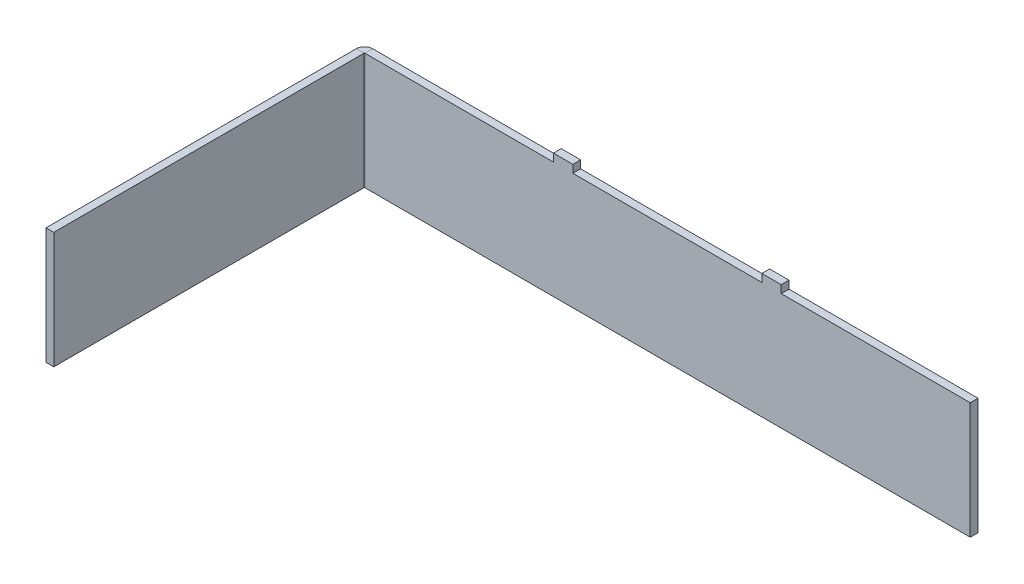
ISO-10303-21;
HEADER;
FILE_DESCRIPTION(('STEP AP214'),'2;1');
FILE_NAME('part.step','',(''),(''),'','','');
FILE_SCHEMA(('AUTOMOTIVE_DESIGN { 1 0 10303 214 1 1 1 1 }'));
ENDSEC;
DATA;
#1=APPLICATION_CONTEXT('core data for automotive mechanical design processes');
#2=APPLICATION_PROTOCOL_DEFINITION('international standard','automotive_design',2000,#1);
#3=PRODUCT_CONTEXT('',#1,'mechanical');
#4=PRODUCT('Part','Part','',(#3));
#5=PRODUCT_RELATED_PRODUCT_CATEGORY('part','',(#4));
#6=PRODUCT_DEFINITION_FORMATION('','',#4);
#7=PRODUCT_DEFINITION_CONTEXT('part definition',#1,'design');
#8=PRODUCT_DEFINITION('design','',#6,#7);
#9=PRODUCT_DEFINITION_SHAPE('','',#8);
#10=(LENGTH_UNIT() NAMED_UNIT(*) SI_UNIT(.MILLI.,.METRE.));
#11=(NAMED_UNIT(*) PLANE_ANGLE_UNIT() SI_UNIT($,.RADIAN.));
#12=(NAMED_UNIT(*) SI_UNIT($,.STERADIAN.) SOLID_ANGLE_UNIT());
#13=UNCERTAINTY_MEASURE_WITH_UNIT(LENGTH_MEASURE(1.E-05),#10,'distance_accuracy_value','');
#14=(GEOMETRIC_REPRESENTATION_CONTEXT(3) GLOBAL_UNCERTAINTY_ASSIGNED_CONTEXT((#13)) GLOBAL_UNIT_ASSIGNED_CONTEXT((#10,
#11,#12)) REPRESENTATION_CONTEXT('',''));
#15=CARTESIAN_POINT('',(0.,0.,0.));
#16=DIRECTION('',(0.,0.,1.));
#17=DIRECTION('',(1.,0.,0.));
#18=AXIS2_PLACEMENT_3D('',#15,#16,#17);
#19=CARTESIAN_POINT('',(718.692823516397,2.00000000000117,-26.0000000000004));
#20=DIRECTION('',(0.,0.,1.));
#21=DIRECTION('',(1.,0.,0.));
#22=AXIS2_PLACEMENT_3D('',#19,#20,#21);
#23=PLANE('',#22);
#24=DIRECTION('',(-1.,0.,0.));
#25=VECTOR('',#24,1.);
#26=CARTESIAN_POINT('',(718.692823516397,1.16874081210637E-12,-26.0000000000004));
#27=LINE('',#26,#25);
#28=CARTESIAN_POINT('',(550.,0.,-26.0000000000004));
#29=VERTEX_POINT('',#28);
#30=CARTESIAN_POINT('',(548.,0.,-26.0000000000004));
#31=VERTEX_POINT('',#30);
#32=EDGE_CURVE('E197',#29,#31,#27,.T.);
#33=ORIENTED_EDGE('',*,*,#32,.T.);
#34=DIRECTION('',(0.,1.,0.));
#35=VECTOR('',#34,1.);
#36=CARTESIAN_POINT('',(548.,2.00000000000006,-26.0000000000004));
#37=LINE('',#36,#35);
#38=CARTESIAN_POINT('',(548.,-29.9999999999999,-26.0000000000004));
#39=VERTEX_POINT('',#38);
#40=EDGE_CURVE('E180',#39,#31,#37,.T.);
#41=ORIENTED_EDGE('',*,*,#40,.F.);
#42=DIRECTION('',(-1.,0.,0.));
#43=VECTOR('',#42,1.);
#44=CARTESIAN_POINT('',(718.692823516398,-29.9999999999988,-26.0000000000003));
#45=LINE('',#44,#43);
#46=CARTESIAN_POINT('',(550.,-29.9999999999999,-26.0000000000003));
#47=VERTEX_POINT('',#46);
#48=EDGE_CURVE('E188',#47,#39,#45,.T.);
#49=ORIENTED_EDGE('',*,*,#48,.F.);
#50=DIRECTION('',(0.,1.,0.));
#51=VECTOR('',#50,1.);
#52=CARTESIAN_POINT('',(550.,2.00000000000008,-26.0000000000004));
#53=LINE('',#52,#51);
#54=EDGE_CURVE('E181',#47,#29,#53,.T.);
#55=ORIENTED_EDGE('',*,*,#54,.T.);
#56=EDGE_LOOP('',(#33,#41,#49,#55));
#57=FACE_BOUND('',#56,.T.);
#58=ADVANCED_FACE('F45',(#57),#23,.T.);
#59=CARTESIAN_POINT('',(718.692823516397,1.74790715661915E-12,600.));
#60=DIRECTION('',(0.,-1.,0.));
#61=DIRECTION('',(-1.,0.,0.));
#62=AXIS2_PLACEMENT_3D('',#59,#60,#61);
#63=PLANE('',#62);
#64=DIRECTION('',(0.,0.,-1.));
#65=VECTOR('',#64,1.);
#66=CARTESIAN_POINT('',(548.,0.,-108.));
#67=LINE('',#66,#65);
#68=CARTESIAN_POINT('',(548.,0.,-105.9));
#69=VERTEX_POINT('',#68);
#70=EDGE_CURVE('E175',#31,#69,#67,.T.);
#71=ORIENTED_EDGE('',*,*,#70,.F.);
#72=ORIENTED_EDGE('',*,*,#32,.F.);
#73=DIRECTION('',(0.,0.,1.));
#74=VECTOR('',#73,1.);
#75=CARTESIAN_POINT('',(550.,6.55401658870381E-13,600.));
#76=LINE('',#75,#74);
#77=CARTESIAN_POINT('',(550.,0.,-105.9));
#78=VERTEX_POINT('',#77);
#79=EDGE_CURVE('E12',#78,#29,#76,.T.);
#80=ORIENTED_EDGE('',*,*,#79,.F.);
#81=DIRECTION('',(-1.,0.,0.));
#82=VECTOR('',#81,1.);
#83=CARTESIAN_POINT('',(718.692823516397,1.09481846238341E-12,-105.9));
#84=LINE('',#83,#82);
#85=EDGE_CURVE('E172',#78,#69,#84,.T.);
#86=ORIENTED_EDGE('',*,*,#85,.T.);
#87=EDGE_LOOP('',(#71,#72,#80,#86));
#88=FACE_BOUND('',#87,.T.);
#89=ADVANCED_FACE('F174',(#88),#63,.F.);
#90=CARTESIAN_POINT('',(548.,-29.9999999999999,-28.0000000000004));
#91=DIRECTION('',(-1.,0.,0.));
#92=DIRECTION('',(0.,0.,1.));
#93=AXIS2_PLACEMENT_3D('',#90,#91,#92);
#94=PLANE('',#93);
#95=DIRECTION('',(0.,1.,0.));
#96=VECTOR('',#95,1.);
#97=CARTESIAN_POINT('',(548.,0.,-105.9));
#98=LINE('',#97,#96);
#99=CARTESIAN_POINT('',(548.,-30.,-105.9));
#100=VERTEX_POINT('',#99);
#101=EDGE_CURVE('E186',#100,#69,#98,.T.);
#102=ORIENTED_EDGE('',*,*,#101,.F.);
#103=DIRECTION('',(0.,0.,-1.));
#104=VECTOR('',#103,1.);
#105=CARTESIAN_POINT('',(548.,-29.9999999999999,-28.0000000000003));
#106=LINE('',#105,#104);
#107=EDGE_CURVE('E284',#39,#100,#106,.T.);
#108=ORIENTED_EDGE('',*,*,#107,.F.);
#109=ORIENTED_EDGE('',*,*,#40,.T.);
#110=ORIENTED_EDGE('',*,*,#70,.T.);
#111=EDGE_LOOP('',(#102,#108,#109,#110));
#112=FACE_BOUND('',#111,.T.);
#113=ADVANCED_FACE('F185',(#112),#94,.T.);
#114=CARTESIAN_POINT('',(718.692823516398,-29.9999999999988,-28.0000000000003));
#115=DIRECTION('',(0.,-1.,0.));
#116=DIRECTION('',(-1.,0.,0.));
#117=AXIS2_PLACEMENT_3D('',#114,#115,#116);
#118=PLANE('',#117);
#119=ORIENTED_EDGE('',*,*,#48,.T.);
#120=ORIENTED_EDGE('',*,*,#107,.T.);
#121=DIRECTION('',(-1.,0.,0.));
#122=VECTOR('',#121,1.);
#123=CARTESIAN_POINT('',(718.692823516398,-29.9999999999989,-105.9));
#124=LINE('',#123,#122);
#125=CARTESIAN_POINT('',(550.,-30.,-105.9));
#126=VERTEX_POINT('',#125);
#127=EDGE_CURVE('E49',#126,#100,#124,.T.);
#128=ORIENTED_EDGE('',*,*,#127,.F.);
#129=DIRECTION('',(0.,0.,-1.));
#130=VECTOR('',#129,1.);
#131=CARTESIAN_POINT('',(550.,-29.9999999999999,-28.0000000000003));
#132=LINE('',#131,#130);
#133=EDGE_CURVE('E64',#47,#126,#132,.T.);
#134=ORIENTED_EDGE('',*,*,#133,.F.);
#135=EDGE_LOOP('',(#119,#120,#128,#134));
#136=FACE_BOUND('',#135,.T.);
#137=ADVANCED_FACE('F430',(#136),#118,.T.);
#138=CARTESIAN_POINT('',(550.,6.55401658870381E-13,600.));
#139=DIRECTION('',(-1.,0.,0.));
#140=DIRECTION('',(0.,0.,1.));
#141=AXIS2_PLACEMENT_3D('',#138,#139,#140);
#142=PLANE('',#141);
#143=ORIENTED_EDGE('',*,*,#133,.T.);
#144=DIRECTION('',(0.,1.,0.));
#145=VECTOR('',#144,1.);
#146=CARTESIAN_POINT('',(550.,0.,-105.9));
#147=LINE('',#146,#145);
#148=EDGE_CURVE('E55',#126,#78,#147,.T.);
#149=ORIENTED_EDGE('',*,*,#148,.T.);
#150=ORIENTED_EDGE('',*,*,#79,.T.);
#151=ORIENTED_EDGE('',*,*,#54,.F.);
#152=EDGE_LOOP('',(#143,#149,#150,#151));
#153=FACE_BOUND('',#152,.T.);
#154=ADVANCED_FACE('F47',(#153),#142,.F.);
#155=CARTESIAN_POINT('',(-710.,0.,210.300549795315));
#156=DIRECTION('',(0.,1.,0.));
#157=DIRECTION('',(0.,0.,1.));
#158=AXIS2_PLACEMENT_3D('',#155,#156,#157);
#159=PLANE('',#158);
#160=DIRECTION('',(1.,0.,0.));
#161=VECTOR('',#160,1.);
#162=CARTESIAN_POINT('',(708.,0.,-108.));
#163=LINE('',#162,#161);
#164=CARTESIAN_POINT('',(550.1,0.,-108.));
#165=VERTEX_POINT('',#164);
#166=CARTESIAN_POINT('',(598.666666666667,0.,-108.));
#167=VERTEX_POINT('',#166);
#168=EDGE_CURVE('E94',#165,#167,#163,.T.);
#169=ORIENTED_EDGE('',*,*,#168,.F.);
#170=DIRECTION('',(0.,0.,-1.));
#171=VECTOR('',#170,1.);
#172=CARTESIAN_POINT('',(550.1,0.,210.300549795315));
#173=LINE('',#172,#171);
#174=CARTESIAN_POINT('',(550.1,0.,-106.));
#175=VERTEX_POINT('',#174);
#176=EDGE_CURVE('E200',#175,#165,#173,.T.);
#177=ORIENTED_EDGE('',*,*,#176,.F.);
#178=DIRECTION('',(1.,0.,0.));
#179=VECTOR('',#178,1.);
#180=CARTESIAN_POINT('',(-710.,0.,-106.));
#181=LINE('',#180,#179);
#182=CARTESIAN_POINT('',(598.666666666667,0.,-106.));
#183=VERTEX_POINT('',#182);
#184=EDGE_CURVE('E216',#175,#183,#181,.T.);
#185=ORIENTED_EDGE('',*,*,#184,.T.);
#186=DIRECTION('',(0.,0.,-1.));
#187=VECTOR('',#186,1.);
#188=CARTESIAN_POINT('',(598.666666666667,0.,210.300549795315));
#189=LINE('',#188,#187);
#190=EDGE_CURVE('E274',#183,#167,#189,.T.);
#191=ORIENTED_EDGE('',*,*,#190,.T.);
#192=EDGE_LOOP('',(#169,#177,#185,#191));
#193=FACE_BOUND('',#192,.T.);
#194=ADVANCED_FACE('F318',(#193),#159,.T.);
#195=CARTESIAN_POINT('',(550.,-30.,210.300549795315));
#196=DIRECTION('',(0.,1.,0.));
#197=DIRECTION('',(0.,0.,1.));
#198=AXIS2_PLACEMENT_3D('',#195,#196,#197);
#199=PLANE('',#198);
#200=DIRECTION('',(0.,0.,-1.));
#201=VECTOR('',#200,1.);
#202=CARTESIAN_POINT('',(550.1,-30.,210.300549795315));
#203=LINE('',#202,#201);
#204=CARTESIAN_POINT('',(550.1,-30.,-106.));
#205=VERTEX_POINT('',#204);
#206=CARTESIAN_POINT('',(550.1,-30.,-108.));
#207=VERTEX_POINT('',#206);
#208=EDGE_CURVE('E303',#205,#207,#203,.T.);
#209=ORIENTED_EDGE('',*,*,#208,.T.);
#210=DIRECTION('',(-1.,0.,0.));
#211=VECTOR('',#210,1.);
#212=CARTESIAN_POINT('',(708.,-30.,-108.));
#213=LINE('',#212,#211);
#214=CARTESIAN_POINT('',(706.,-30.,-108.));
#215=VERTEX_POINT('',#214);
#216=EDGE_CURVE('E217',#215,#207,#213,.T.);
#217=ORIENTED_EDGE('',*,*,#216,.F.);
#218=DIRECTION('',(0.,0.,-1.));
#219=VECTOR('',#218,1.);
#220=CARTESIAN_POINT('',(706.,-30.,210.300549795315));
#221=LINE('',#220,#219);
#222=CARTESIAN_POINT('',(706.,-30.,-106.));
#223=VERTEX_POINT('',#222);
#224=EDGE_CURVE('E307',#223,#215,#221,.T.);
#225=ORIENTED_EDGE('',*,*,#224,.F.);
#226=DIRECTION('',(1.,0.,0.));
#227=VECTOR('',#226,1.);
#228=CARTESIAN_POINT('',(550.,-30.,-106.));
#229=LINE('',#228,#227);
#230=EDGE_CURVE('E223',#205,#223,#229,.T.);
#231=ORIENTED_EDGE('',*,*,#230,.F.);
#232=EDGE_LOOP('',(#209,#217,#225,#231));
#233=FACE_BOUND('',#232,.T.);
#234=ADVANCED_FACE('F311',(#233),#199,.F.);
#235=CARTESIAN_POINT('',(706.,2.,210.300549795315));
#236=DIRECTION('',(-1.,0.,0.));
#237=DIRECTION('',(0.,0.,1.));
#238=AXIS2_PLACEMENT_3D('',#235,#236,#237);
#239=PLANE('',#238);
#240=ORIENTED_EDGE('',*,*,#224,.T.);
#241=DIRECTION('',(0.,-1.,0.));
#242=VECTOR('',#241,1.);
#243=CARTESIAN_POINT('',(706.,-209.788764943753,-108.));
#244=LINE('',#243,#242);
#245=CARTESIAN_POINT('',(706.,0.,-108.));
#246=VERTEX_POINT('',#245);
#247=EDGE_CURVE('E382',#246,#215,#244,.T.);
#248=ORIENTED_EDGE('',*,*,#247,.F.);
#249=DIRECTION('',(0.,0.,-1.));
#250=VECTOR('',#249,1.);
#251=CARTESIAN_POINT('',(706.,0.,210.300549795315));
#252=LINE('',#251,#250);
#253=CARTESIAN_POINT('',(706.,0.,-106.));
#254=VERTEX_POINT('',#253);
#255=EDGE_CURVE('E322',#254,#246,#252,.T.);
#256=ORIENTED_EDGE('',*,*,#255,.F.);
#257=DIRECTION('',(0.,1.,0.));
#258=VECTOR('',#257,1.);
#259=CARTESIAN_POINT('',(706.,2.,-106.));
#260=LINE('',#259,#258);
#261=EDGE_CURVE('E246',#223,#254,#260,.T.);
#262=ORIENTED_EDGE('',*,*,#261,.F.);
#263=EDGE_LOOP('',(#240,#248,#256,#262));
#264=FACE_BOUND('',#263,.T.);
#265=ADVANCED_FACE('F405',(#264),#239,.F.);
#266=CARTESIAN_POINT('',(657.333333333333,0.,-108.));
#267=VERTEX_POINT('',#266);
#268=EDGE_CURVE('E354',#267,#246,#163,.T.);
#269=ORIENTED_EDGE('',*,*,#268,.F.);
#270=DIRECTION('',(0.,0.,-1.));
#271=VECTOR('',#270,1.);
#272=CARTESIAN_POINT('',(657.333333333333,0.,210.300549795315));
#273=LINE('',#272,#271);
#274=CARTESIAN_POINT('',(657.333333333333,0.,-106.));
#275=VERTEX_POINT('',#274);
#276=EDGE_CURVE('E325',#275,#267,#273,.T.);
#277=ORIENTED_EDGE('',*,*,#276,.F.);
#278=EDGE_CURVE('E225',#275,#254,#181,.T.);
#279=ORIENTED_EDGE('',*,*,#278,.T.);
#280=ORIENTED_EDGE('',*,*,#255,.T.);
#281=EDGE_LOOP('',(#269,#277,#279,#280));
#282=FACE_BOUND('',#281,.T.);
#283=ADVANCED_FACE('F406',(#282),#159,.T.);
#284=CARTESIAN_POINT('',(657.333333333333,0.,210.300549795315));
#285=DIRECTION('',(-1.,0.,0.));
#286=DIRECTION('',(0.,0.,1.));
#287=AXIS2_PLACEMENT_3D('',#284,#285,#286);
#288=PLANE('',#287);
#289=ORIENTED_EDGE('',*,*,#276,.T.);
#290=DIRECTION('',(0.,1.,0.));
#291=VECTOR('',#290,1.);
#292=CARTESIAN_POINT('',(657.333333333333,0.,-108.));
#293=LINE('',#292,#291);
#294=CARTESIAN_POINT('',(657.333333333333,2.,-108.));
#295=VERTEX_POINT('',#294);
#296=EDGE_CURVE('E379',#267,#295,#293,.T.);
#297=ORIENTED_EDGE('',*,*,#296,.T.);
#298=DIRECTION('',(0.,0.,-1.));
#299=VECTOR('',#298,1.);
#300=CARTESIAN_POINT('',(657.333333333333,2.,210.300549795315));
#301=LINE('',#300,#299);
#302=CARTESIAN_POINT('',(657.333333333333,2.,-106.));
#303=VERTEX_POINT('',#302);
#304=EDGE_CURVE('E328',#303,#295,#301,.T.);
#305=ORIENTED_EDGE('',*,*,#304,.F.);
#306=DIRECTION('',(0.,1.,0.));
#307=VECTOR('',#306,1.);
#308=CARTESIAN_POINT('',(657.333333333333,0.,-106.));
#309=LINE('',#308,#307);
#310=EDGE_CURVE('E242',#275,#303,#309,.T.);
#311=ORIENTED_EDGE('',*,*,#310,.F.);
#312=EDGE_LOOP('',(#289,#297,#305,#311));
#313=FACE_BOUND('',#312,.T.);
#314=ADVANCED_FACE('F408',(#313),#288,.F.);
#315=CARTESIAN_POINT('',(657.333333333333,2.,210.300549795315));
#316=DIRECTION('',(0.,-1.,0.));
#317=DIRECTION('',(0.,0.,-1.));
#318=AXIS2_PLACEMENT_3D('',#315,#316,#317);
#319=PLANE('',#318);
#320=ORIENTED_EDGE('',*,*,#304,.T.);
#321=DIRECTION('',(-1.,0.,0.));
#322=VECTOR('',#321,1.);
#323=CARTESIAN_POINT('',(657.333333333333,2.,-108.));
#324=LINE('',#323,#322);
#325=CARTESIAN_POINT('',(652.333333333333,2.,-108.));
#326=VERTEX_POINT('',#325);
#327=EDGE_CURVE('E372',#295,#326,#324,.T.);
#328=ORIENTED_EDGE('',*,*,#327,.T.);
#329=DIRECTION('',(0.,0.,-1.));
#330=VECTOR('',#329,1.);
#331=CARTESIAN_POINT('',(652.333333333333,2.,210.300549795315));
#332=LINE('',#331,#330);
#333=CARTESIAN_POINT('',(652.333333333333,2.,-106.));
#334=VERTEX_POINT('',#333);
#335=EDGE_CURVE('E331',#334,#326,#332,.T.);
#336=ORIENTED_EDGE('',*,*,#335,.F.);
#337=DIRECTION('',(-1.,0.,0.));
#338=VECTOR('',#337,1.);
#339=CARTESIAN_POINT('',(657.333333333333,2.,-106.));
#340=LINE('',#339,#338);
#341=EDGE_CURVE('E245',#303,#334,#340,.T.);
#342=ORIENTED_EDGE('',*,*,#341,.F.);
#343=EDGE_LOOP('',(#320,#328,#336,#342));
#344=FACE_BOUND('',#343,.T.);
#345=ADVANCED_FACE('F411',(#344),#319,.F.);
#346=CARTESIAN_POINT('',(652.333333333333,0.,210.300549795315));
#347=DIRECTION('',(1.,0.,0.));
#348=DIRECTION('',(0.,0.,-1.));
#349=AXIS2_PLACEMENT_3D('',#346,#347,#348);
#350=PLANE('',#349);
#351=ORIENTED_EDGE('',*,*,#335,.T.);
#352=DIRECTION('',(0.,-1.,0.));
#353=VECTOR('',#352,1.);
#354=CARTESIAN_POINT('',(652.333333333333,0.,-108.));
#355=LINE('',#354,#353);
#356=CARTESIAN_POINT('',(652.333333333333,0.,-108.));
#357=VERTEX_POINT('',#356);
#358=EDGE_CURVE('E368',#326,#357,#355,.T.);
#359=ORIENTED_EDGE('',*,*,#358,.T.);
#360=DIRECTION('',(0.,0.,-1.));
#361=VECTOR('',#360,1.);
#362=CARTESIAN_POINT('',(652.333333333333,0.,210.300549795315));
#363=LINE('',#362,#361);
#364=CARTESIAN_POINT('',(652.333333333333,0.,-106.));
#365=VERTEX_POINT('',#364);
#366=EDGE_CURVE('E334',#365,#357,#363,.T.);
#367=ORIENTED_EDGE('',*,*,#366,.F.);
#368=DIRECTION('',(0.,-1.,0.));
#369=VECTOR('',#368,1.);
#370=CARTESIAN_POINT('',(652.333333333333,0.,-106.));
#371=LINE('',#370,#369);
#372=EDGE_CURVE('E251',#334,#365,#371,.T.);
#373=ORIENTED_EDGE('',*,*,#372,.F.);
#374=EDGE_LOOP('',(#351,#359,#367,#373));
#375=FACE_BOUND('',#374,.T.);
#376=ADVANCED_FACE('F395',(#375),#350,.F.);
#377=CARTESIAN_POINT('',(603.666666666667,0.,-108.));
#378=VERTEX_POINT('',#377);
#379=EDGE_CURVE('E355',#378,#357,#163,.T.);
#380=ORIENTED_EDGE('',*,*,#379,.F.);
#381=DIRECTION('',(0.,0.,-1.));
#382=VECTOR('',#381,1.);
#383=CARTESIAN_POINT('',(603.666666666667,0.,210.300549795315));
#384=LINE('',#383,#382);
#385=CARTESIAN_POINT('',(603.666666666667,0.,-106.));
#386=VERTEX_POINT('',#385);
#387=EDGE_CURVE('E337',#386,#378,#384,.T.);
#388=ORIENTED_EDGE('',*,*,#387,.F.);
#389=EDGE_CURVE('E224',#386,#365,#181,.T.);
#390=ORIENTED_EDGE('',*,*,#389,.T.);
#391=ORIENTED_EDGE('',*,*,#366,.T.);
#392=EDGE_LOOP('',(#380,#388,#390,#391));
#393=FACE_BOUND('',#392,.T.);
#394=ADVANCED_FACE('F397',(#393),#159,.T.);
#395=CARTESIAN_POINT('',(603.666666666667,0.,210.300549795315));
#396=DIRECTION('',(-1.,0.,0.));
#397=DIRECTION('',(0.,0.,1.));
#398=AXIS2_PLACEMENT_3D('',#395,#396,#397);
#399=PLANE('',#398);
#400=ORIENTED_EDGE('',*,*,#387,.T.);
#401=DIRECTION('',(0.,1.,0.));
#402=VECTOR('',#401,1.);
#403=CARTESIAN_POINT('',(603.666666666667,0.,-108.));
#404=LINE('',#403,#402);
#405=CARTESIAN_POINT('',(603.666666666667,2.,-108.));
#406=VERTEX_POINT('',#405);
#407=EDGE_CURVE('E351',#378,#406,#404,.T.);
#408=ORIENTED_EDGE('',*,*,#407,.T.);
#409=DIRECTION('',(0.,0.,-1.));
#410=VECTOR('',#409,1.);
#411=CARTESIAN_POINT('',(603.666666666667,2.,210.300549795315));
#412=LINE('',#411,#410);
#413=CARTESIAN_POINT('',(603.666666666667,2.,-106.));
#414=VERTEX_POINT('',#413);
#415=EDGE_CURVE('E340',#414,#406,#412,.T.);
#416=ORIENTED_EDGE('',*,*,#415,.F.);
#417=DIRECTION('',(0.,1.,0.));
#418=VECTOR('',#417,1.);
#419=CARTESIAN_POINT('',(603.666666666667,0.,-106.));
#420=LINE('',#419,#418);
#421=EDGE_CURVE('E255',#386,#414,#420,.T.);
#422=ORIENTED_EDGE('',*,*,#421,.F.);
#423=EDGE_LOOP('',(#400,#408,#416,#422));
#424=FACE_BOUND('',#423,.T.);
#425=ADVANCED_FACE('F445',(#424),#399,.F.);
#426=CARTESIAN_POINT('',(603.666666666667,2.,210.300549795315));
#427=DIRECTION('',(0.,-1.,0.));
#428=DIRECTION('',(0.,0.,-1.));
#429=AXIS2_PLACEMENT_3D('',#426,#427,#428);
#430=PLANE('',#429);
#431=ORIENTED_EDGE('',*,*,#415,.T.);
#432=DIRECTION('',(-1.,0.,0.));
#433=VECTOR('',#432,1.);
#434=CARTESIAN_POINT('',(603.666666666667,2.,-108.));
#435=LINE('',#434,#433);
#436=CARTESIAN_POINT('',(598.666666666667,2.,-108.));
#437=VERTEX_POINT('',#436);
#438=EDGE_CURVE('E349',#406,#437,#435,.T.);
#439=ORIENTED_EDGE('',*,*,#438,.T.);
#440=DIRECTION('',(0.,0.,-1.));
#441=VECTOR('',#440,1.);
#442=CARTESIAN_POINT('',(598.666666666667,2.,210.300549795315));
#443=LINE('',#442,#441);
#444=CARTESIAN_POINT('',(598.666666666667,2.,-106.));
#445=VERTEX_POINT('',#444);
#446=EDGE_CURVE('E342',#445,#437,#443,.T.);
#447=ORIENTED_EDGE('',*,*,#446,.F.);
#448=DIRECTION('',(-1.,0.,0.));
#449=VECTOR('',#448,1.);
#450=CARTESIAN_POINT('',(603.666666666667,2.,-106.));
#451=LINE('',#450,#449);
#452=EDGE_CURVE('E263',#414,#445,#451,.T.);
#453=ORIENTED_EDGE('',*,*,#452,.F.);
#454=EDGE_LOOP('',(#431,#439,#447,#453));
#455=FACE_BOUND('',#454,.T.);
#456=ADVANCED_FACE('F449',(#455),#430,.F.);
#457=CARTESIAN_POINT('',(598.666666666667,0.,210.300549795315));
#458=DIRECTION('',(1.,0.,0.));
#459=DIRECTION('',(0.,0.,-1.));
#460=AXIS2_PLACEMENT_3D('',#457,#458,#459);
#461=PLANE('',#460);
#462=ORIENTED_EDGE('',*,*,#446,.T.);
#463=DIRECTION('',(0.,-1.,0.));
#464=VECTOR('',#463,1.);
#465=CARTESIAN_POINT('',(598.666666666667,0.,-108.));
#466=LINE('',#465,#464);
#467=EDGE_CURVE('E347',#437,#167,#466,.T.);
#468=ORIENTED_EDGE('',*,*,#467,.T.);
#469=ORIENTED_EDGE('',*,*,#190,.F.);
#470=DIRECTION('',(0.,-1.,0.));
#471=VECTOR('',#470,1.);
#472=CARTESIAN_POINT('',(598.666666666667,0.,-106.));
#473=LINE('',#472,#471);
#474=EDGE_CURVE('E266',#445,#183,#473,.T.);
#475=ORIENTED_EDGE('',*,*,#474,.F.);
#476=EDGE_LOOP('',(#462,#468,#469,#475));
#477=FACE_BOUND('',#476,.T.);
#478=ADVANCED_FACE('F346',(#477),#461,.F.);
#479=CARTESIAN_POINT('',(-710.,2.,-106.));
#480=DIRECTION('',(0.,0.,1.));
#481=DIRECTION('',(1.,0.,0.));
#482=AXIS2_PLACEMENT_3D('',#479,#480,#481);
#483=PLANE('',#482);
#484=ORIENTED_EDGE('',*,*,#184,.F.);
#485=DIRECTION('',(0.,-1.,0.));
#486=VECTOR('',#485,1.);
#487=CARTESIAN_POINT('',(550.1,0.,-106.));
#488=LINE('',#487,#486);
#489=EDGE_CURVE('E270',#175,#205,#488,.T.);
#490=ORIENTED_EDGE('',*,*,#489,.T.);
#491=ORIENTED_EDGE('',*,*,#230,.T.);
#492=ORIENTED_EDGE('',*,*,#261,.T.);
#493=ORIENTED_EDGE('',*,*,#278,.F.);
#494=ORIENTED_EDGE('',*,*,#310,.T.);
#495=ORIENTED_EDGE('',*,*,#341,.T.);
#496=ORIENTED_EDGE('',*,*,#372,.T.);
#497=ORIENTED_EDGE('',*,*,#389,.F.);
#498=ORIENTED_EDGE('',*,*,#421,.T.);
#499=ORIENTED_EDGE('',*,*,#452,.T.);
#500=ORIENTED_EDGE('',*,*,#474,.T.);
#501=EDGE_LOOP('',(#484,#490,#491,#492,#493,#494,#495,#496,#497,#498,#499,#500));
#502=FACE_BOUND('',#501,.T.);
#503=ADVANCED_FACE('F316',(#502),#483,.T.);
#504=CARTESIAN_POINT('',(708.,-209.788764943753,-108.));
#505=DIRECTION('',(0.,0.,1.));
#506=DIRECTION('',(1.,0.,0.));
#507=AXIS2_PLACEMENT_3D('',#504,#505,#506);
#508=PLANE('',#507);
#509=DIRECTION('',(0.,-1.,0.));
#510=VECTOR('',#509,1.);
#511=CARTESIAN_POINT('',(550.1,0.,-108.));
#512=LINE('',#511,#510);
#513=EDGE_CURVE('E212',#165,#207,#512,.T.);
#514=ORIENTED_EDGE('',*,*,#513,.F.);
#515=ORIENTED_EDGE('',*,*,#168,.T.);
#516=ORIENTED_EDGE('',*,*,#467,.F.);
#517=ORIENTED_EDGE('',*,*,#438,.F.);
#518=ORIENTED_EDGE('',*,*,#407,.F.);
#519=ORIENTED_EDGE('',*,*,#379,.T.);
#520=ORIENTED_EDGE('',*,*,#358,.F.);
#521=ORIENTED_EDGE('',*,*,#327,.F.);
#522=ORIENTED_EDGE('',*,*,#296,.F.);
#523=ORIENTED_EDGE('',*,*,#268,.T.);
#524=ORIENTED_EDGE('',*,*,#247,.T.);
#525=ORIENTED_EDGE('',*,*,#216,.T.);
#526=EDGE_LOOP('',(#514,#515,#516,#517,#518,#519,#520,#521,#522,#523,#524,#525));
#527=FACE_BOUND('',#526,.T.);
#528=ADVANCED_FACE('F389',(#527),#508,.F.);
#529=CARTESIAN_POINT('',(550.1,-30.,-105.9));
#530=DIRECTION('',(0.,-1.,0.));
#531=DIRECTION('',(0.,0.,-1.));
#532=AXIS2_PLACEMENT_3D('',#529,#530,#531);
#533=PLANE('',#532);
#534=ORIENTED_EDGE('',*,*,#208,.F.);
#535=CARTESIAN_POINT('',(550.1,-30.,-105.9));
#536=DIRECTION('',(0.,-1.,0.));
#537=DIRECTION('',(1.,0.,0.));
#538=AXIS2_PLACEMENT_3D('',#535,#536,#537);
#539=CIRCLE('',#538,0.100000000000031);
#540=EDGE_CURVE('E102',#205,#126,#539,.F.);
#541=ORIENTED_EDGE('',*,*,#540,.T.);
#542=ORIENTED_EDGE('',*,*,#127,.T.);
#543=CARTESIAN_POINT('',(550.1,-30.,-105.9));
#544=DIRECTION('',(0.,-1.,0.));
#545=DIRECTION('',(1.,0.,0.));
#546=AXIS2_PLACEMENT_3D('',#543,#544,#545);
#547=CIRCLE('',#546,2.09999999999986);
#548=EDGE_CURVE('E196',#207,#100,#547,.F.);
#549=ORIENTED_EDGE('',*,*,#548,.F.);
#550=EDGE_LOOP('',(#534,#541,#542,#549));
#551=FACE_BOUND('',#550,.T.);
#552=ADVANCED_FACE('F301',(#551),#533,.T.);
#553=CARTESIAN_POINT('',(550.1,0.,-105.9));
#554=DIRECTION('',(0.,1.,0.));
#555=DIRECTION('',(0.,0.,1.));
#556=AXIS2_PLACEMENT_3D('',#553,#554,#555);
#557=PLANE('',#556);
#558=ORIENTED_EDGE('',*,*,#85,.F.);
#559=CARTESIAN_POINT('',(550.1,0.,-105.9));
#560=DIRECTION('',(0.,-1.,0.));
#561=DIRECTION('',(1.,0.,0.));
#562=AXIS2_PLACEMENT_3D('',#559,#560,#561);
#563=CIRCLE('',#562,0.100000000000031);
#564=EDGE_CURVE('E203',#78,#175,#563,.T.);
#565=ORIENTED_EDGE('',*,*,#564,.T.);
#566=ORIENTED_EDGE('',*,*,#176,.T.);
#567=CARTESIAN_POINT('',(550.1,0.,-105.9));
#568=DIRECTION('',(0.,-1.,0.));
#569=DIRECTION('',(1.,0.,0.));
#570=AXIS2_PLACEMENT_3D('',#567,#568,#569);
#571=CIRCLE('',#570,2.09999999999986);
#572=EDGE_CURVE('E195',#69,#165,#571,.T.);
#573=ORIENTED_EDGE('',*,*,#572,.F.);
#574=EDGE_LOOP('',(#558,#565,#566,#573));
#575=FACE_BOUND('',#574,.T.);
#576=ADVANCED_FACE('F198',(#575),#557,.T.);
#577=CARTESIAN_POINT('',(550.099999999999,238.762559879056,-105.9));
#578=DIRECTION('',(0.,-1.,0.));
#579=DIRECTION('',(1.,0.,0.));
#580=AXIS2_PLACEMENT_3D('',#577,#578,#579);
#581=CYLINDRICAL_SURFACE('',#580,2.09999999999986);
#582=ORIENTED_EDGE('',*,*,#572,.T.);
#583=ORIENTED_EDGE('',*,*,#513,.T.);
#584=ORIENTED_EDGE('',*,*,#548,.T.);
#585=ORIENTED_EDGE('',*,*,#101,.T.);
#586=EDGE_LOOP('',(#582,#583,#584,#585));
#587=FACE_BOUND('',#586,.T.);
#588=ADVANCED_FACE('F193',(#587),#581,.T.);
#589=CARTESIAN_POINT('',(550.099999999999,238.762559879056,-105.9));
#590=DIRECTION('',(0.,-1.,0.));
#591=DIRECTION('',(1.,0.,0.));
#592=AXIS2_PLACEMENT_3D('',#589,#590,#591);
#593=CYLINDRICAL_SURFACE('',#592,0.100000000000031);
#594=ORIENTED_EDGE('',*,*,#564,.F.);
#595=ORIENTED_EDGE('',*,*,#148,.F.);
#596=ORIENTED_EDGE('',*,*,#540,.F.);
#597=ORIENTED_EDGE('',*,*,#489,.F.);
#598=EDGE_LOOP('',(#594,#595,#596,#597));
#599=FACE_BOUND('',#598,.T.);
#600=ADVANCED_FACE('F299',(#599),#593,.F.);
#601=CLOSED_SHELL('',(#58,#89,#113,#137,#154,#194,#234,#265,#283,#314,#345,#376,#394,#425,#456,
#478,#503,#528,#552,#576,#588,#600));
#602=MANIFOLD_SOLID_BREP('B2',#601);
#603=ADVANCED_BREP_SHAPE_REPRESENTATION('',(#18,#602),#14);
#604=SHAPE_DEFINITION_REPRESENTATION(#9,#603);
ENDSEC;
END-ISO-10303-21;
